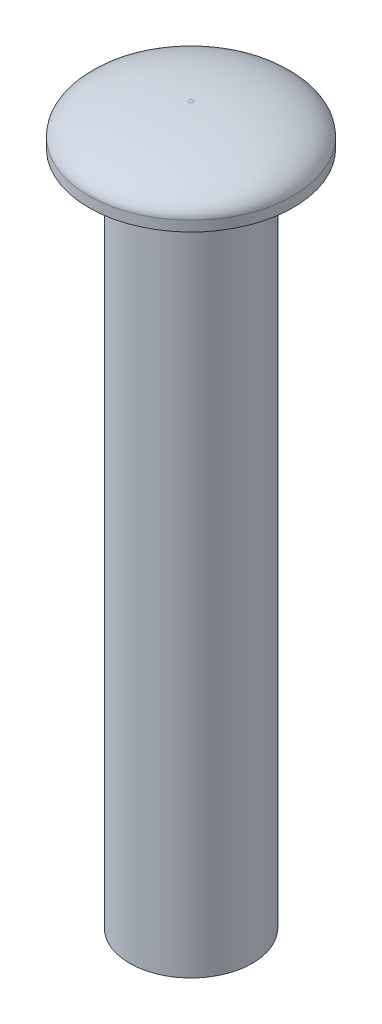
ISO-10303-21;
HEADER;
FILE_DESCRIPTION(('STEP AP214'),'2;1');
FILE_NAME('part.step','',(''),(''),'','','');
FILE_SCHEMA(('AUTOMOTIVE_DESIGN { 1 0 10303 214 1 1 1 1 }'));
ENDSEC;
DATA;
#1=APPLICATION_CONTEXT('core data for automotive mechanical design processes');
#2=APPLICATION_PROTOCOL_DEFINITION('international standard','automotive_design',2000,#1);
#3=PRODUCT_CONTEXT('',#1,'mechanical');
#4=PRODUCT('Part','Part','',(#3));
#5=PRODUCT_RELATED_PRODUCT_CATEGORY('part','',(#4));
#6=PRODUCT_DEFINITION_FORMATION('','',#4);
#7=PRODUCT_DEFINITION_CONTEXT('part definition',#1,'design');
#8=PRODUCT_DEFINITION('design','',#6,#7);
#9=PRODUCT_DEFINITION_SHAPE('','',#8);
#10=(LENGTH_UNIT() NAMED_UNIT(*) SI_UNIT(.MILLI.,.METRE.));
#11=(NAMED_UNIT(*) PLANE_ANGLE_UNIT() SI_UNIT($,.RADIAN.));
#12=(NAMED_UNIT(*) SI_UNIT($,.STERADIAN.) SOLID_ANGLE_UNIT());
#13=UNCERTAINTY_MEASURE_WITH_UNIT(LENGTH_MEASURE(1.E-05),#10,'distance_accuracy_value','');
#14=(GEOMETRIC_REPRESENTATION_CONTEXT(3) GLOBAL_UNCERTAINTY_ASSIGNED_CONTEXT((#13)) GLOBAL_UNIT_ASSIGNED_CONTEXT((#10,
#11,#12)) REPRESENTATION_CONTEXT('',''));
#15=CARTESIAN_POINT('',(0.,0.,0.));
#16=DIRECTION('',(0.,0.,1.));
#17=DIRECTION('',(1.,0.,0.));
#18=AXIS2_PLACEMENT_3D('',#15,#16,#17);
#19=CARTESIAN_POINT('',(0.,-27.,0.));
#20=DIRECTION('',(0.,1.,0.));
#21=DIRECTION('',(0.,0.,1.));
#22=AXIS2_PLACEMENT_3D('',#19,#20,#21);
#23=PLANE('',#22);
#24=CARTESIAN_POINT('',(0.,-27.,0.));
#25=DIRECTION('',(0.,1.,0.));
#26=DIRECTION('',(0.,0.,1.));
#27=AXIS2_PLACEMENT_3D('',#24,#25,#26);
#28=CIRCLE('',#27,2.4);
#29=CARTESIAN_POINT('',(0.,-27.,2.4));
#30=VERTEX_POINT('',#29);
#31=EDGE_CURVE('E66',#30,#30,#28,.T.);
#32=ORIENTED_EDGE('',*,*,#31,.F.);
#33=EDGE_LOOP('',(#32));
#34=FACE_BOUND('',#33,.T.);
#35=ADVANCED_FACE('F48',(#34),#23,.F.);
#36=CARTESIAN_POINT('',(0.,1.,0.));
#37=DIRECTION('',(0.,1.,0.));
#38=DIRECTION('',(0.,0.,1.));
#39=AXIS2_PLACEMENT_3D('',#36,#37,#38);
#40=CYLINDRICAL_SURFACE('',#39,2.4);
#41=CARTESIAN_POINT('',(0.,-34.,0.));
#42=DIRECTION('',(0.,1.,0.));
#43=DIRECTION('',(0.,0.,1.));
#44=AXIS2_PLACEMENT_3D('',#41,#42,#43);
#45=CIRCLE('',#44,2.4);
#46=CARTESIAN_POINT('',(0.,-34.,2.4));
#47=VERTEX_POINT('',#46);
#48=EDGE_CURVE('E71',#47,#47,#45,.T.);
#49=ORIENTED_EDGE('',*,*,#48,.F.);
#50=EDGE_LOOP('',(#49));
#51=FACE_BOUND('',#50,.T.);
#52=ORIENTED_EDGE('',*,*,#31,.T.);
#53=EDGE_LOOP('',(#52));
#54=FACE_BOUND('',#53,.T.);
#55=ADVANCED_FACE('F121',(#51,#54),#40,.F.);
#56=CARTESIAN_POINT('',(0.,-34.,0.));
#57=DIRECTION('',(0.,1.,0.));
#58=DIRECTION('',(0.,0.,1.));
#59=AXIS2_PLACEMENT_3D('',#56,#57,#58);
#60=PLANE('',#59);
#61=CARTESIAN_POINT('',(0.,-34.,0.));
#62=DIRECTION('',(0.,1.,0.));
#63=DIRECTION('',(0.,0.,1.));
#64=AXIS2_PLACEMENT_3D('',#61,#62,#63);
#65=CIRCLE('',#64,3.);
#66=CARTESIAN_POINT('',(0.,-34.,2.99999999999999));
#67=VERTEX_POINT('',#66);
#68=EDGE_CURVE('E76',#67,#67,#65,.T.);
#69=ORIENTED_EDGE('',*,*,#68,.F.);
#70=EDGE_LOOP('',(#69));
#71=FACE_BOUND('',#70,.T.);
#72=ORIENTED_EDGE('',*,*,#48,.T.);
#73=EDGE_LOOP('',(#72));
#74=FACE_BOUND('',#73,.T.);
#75=ADVANCED_FACE('F126',(#71,#74),#60,.F.);
#76=CARTESIAN_POINT('',(0.,1.,0.));
#77=DIRECTION('',(0.,1.,0.));
#78=DIRECTION('',(0.,0.,1.));
#79=AXIS2_PLACEMENT_3D('',#76,#77,#78);
#80=CYLINDRICAL_SURFACE('',#79,3.);
#81=CARTESIAN_POINT('',(0.,-1.,0.));
#82=DIRECTION('',(0.,1.,0.));
#83=DIRECTION('',(0.,0.,1.));
#84=AXIS2_PLACEMENT_3D('',#81,#82,#83);
#85=CIRCLE('',#84,3.);
#86=CARTESIAN_POINT('',(0.,-1.,3.));
#87=VERTEX_POINT('',#86);
#88=EDGE_CURVE('E142',#87,#87,#85,.T.);
#89=ORIENTED_EDGE('',*,*,#88,.F.);
#90=EDGE_LOOP('',(#89));
#91=FACE_BOUND('',#90,.T.);
#92=ORIENTED_EDGE('',*,*,#68,.T.);
#93=EDGE_LOOP('',(#92));
#94=FACE_BOUND('',#93,.T.);
#95=ADVANCED_FACE('F131',(#91,#94),#80,.T.);
#96=CARTESIAN_POINT('',(0.,-0.999999999999999,0.));
#97=DIRECTION('',(0.,1.,0.));
#98=DIRECTION('',(0.,0.,1.));
#99=AXIS2_PLACEMENT_3D('',#96,#97,#98);
#100=PLANE('',#99);
#101=CARTESIAN_POINT('',(0.,-1.,0.));
#102=DIRECTION('',(0.,1.,0.));
#103=DIRECTION('',(0.,0.,1.));
#104=AXIS2_PLACEMENT_3D('',#101,#102,#103);
#105=CIRCLE('',#104,5.);
#106=CARTESIAN_POINT('',(0.,-1.,5.));
#107=VERTEX_POINT('',#106);
#108=EDGE_CURVE('E145',#107,#107,#105,.T.);
#109=ORIENTED_EDGE('',*,*,#108,.F.);
#110=EDGE_LOOP('',(#109));
#111=FACE_BOUND('',#110,.T.);
#112=ORIENTED_EDGE('',*,*,#88,.T.);
#113=EDGE_LOOP('',(#112));
#114=FACE_BOUND('',#113,.T.);
#115=ADVANCED_FACE('F97',(#111,#114),#100,.F.);
#116=CARTESIAN_POINT('',(0.,1.,0.));
#117=DIRECTION('',(0.,1.,0.));
#118=DIRECTION('',(0.,0.,1.));
#119=AXIS2_PLACEMENT_3D('',#116,#117,#118);
#120=CYLINDRICAL_SURFACE('',#119,5.);
#121=CARTESIAN_POINT('',(0.,-0.499999999999999,5.));
#122=CARTESIAN_POINT('',(0.654487561244589,-0.499999999999999,5.));
#123=CARTESIAN_POINT('',(1.30874949970835,-0.499999999999999,4.86985920893377));
#124=CARTESIAN_POINT('',(2.51808482394255,-0.499999999999999,4.3689361161791));
#125=CARTESIAN_POINT('',(3.07274131317444,-0.499999999999999,3.99832649869103));
#126=CARTESIAN_POINT('',(3.99832649869103,-0.499999999999999,3.07274131317444));
#127=CARTESIAN_POINT('',(4.3689361161791,-0.499999999999999,2.51808482394254));
#128=CARTESIAN_POINT('',(4.86985920893377,-0.499999999999999,1.30874949970835));
#129=CARTESIAN_POINT('',(5.,-0.499999999999999,0.654487561244589));
#130=CARTESIAN_POINT('',(5.,-0.499999999999999,-0.654487561244592));
#131=CARTESIAN_POINT('',(4.86985920893377,-0.499999999999999,-1.30874949970835));
#132=CARTESIAN_POINT('',(4.3689361161791,-0.499999999999999,-2.51808482394256));
#133=CARTESIAN_POINT('',(3.99832649869103,-0.499999999999999,-3.07274131317445));
#134=CARTESIAN_POINT('',(3.07274131317444,-0.499999999999999,-3.99832649869103));
#135=CARTESIAN_POINT('',(2.51808482394256,-0.499999999999999,-4.3689361161791));
#136=CARTESIAN_POINT('',(1.30874949970835,-0.499999999999999,-4.86985920893377));
#137=CARTESIAN_POINT('',(0.654487561244591,-0.499999999999999,-5.));
#138=CARTESIAN_POINT('',(-0.654487561244589,-0.499999999999999,-5.));
#139=CARTESIAN_POINT('',(-1.30874949970834,-0.499999999999999,-4.86985920893378));
#140=CARTESIAN_POINT('',(-2.51808482394255,-0.499999999999999,-4.36893611617911));
#141=CARTESIAN_POINT('',(-3.07274131317445,-0.499999999999999,-3.99832649869103));
#142=CARTESIAN_POINT('',(-3.99832649869103,-0.499999999999999,-3.07274131317444));
#143=CARTESIAN_POINT('',(-4.3689361161791,-0.499999999999999,-2.51808482394256));
#144=CARTESIAN_POINT('',(-4.86985920893377,-0.499999999999999,-1.30874949970835));
#145=CARTESIAN_POINT('',(-5.,-0.499999999999999,-0.654487561244585));
#146=CARTESIAN_POINT('',(-5.,-0.499999999999999,0.654487561244597));
#147=CARTESIAN_POINT('',(-4.86985920893377,-0.499999999999999,1.30874949970833));
#148=CARTESIAN_POINT('',(-4.3689361161791,-0.499999999999999,2.51808482394254));
#149=CARTESIAN_POINT('',(-3.99832649869103,-0.499999999999999,3.07274131317443));
#150=CARTESIAN_POINT('',(-3.07274131317446,-0.499999999999999,3.99832649869102));
#151=CARTESIAN_POINT('',(-2.51808482394256,-0.499999999999999,4.36893611617909));
#152=CARTESIAN_POINT('',(-1.30874949970836,-0.499999999999999,4.86985920893377));
#153=CARTESIAN_POINT('',(-0.65448756124459,-0.499999999999999,5.));
#154=CARTESIAN_POINT('',(0.,-0.499999999999999,5.));
#155=(BOUNDED_CURVE() B_SPLINE_CURVE(3,(#121,#122,#123,#124,#125,#126,#127,#128,#129,#130,#131,
#132,#133,#134,#135,#136,#137,#138,#139,#140,#141,#142,#143,#144,#145,#146,#147,#148,#149,#150,
#151,#152,#153,#154),.UNSPECIFIED.,.T.,.F.) B_SPLINE_CURVE_WITH_KNOTS((4,2,2,2,2,2,2,2,2,2,2,2,
2,2,2,2,4),(0.,0.392699081698724,0.785398163397448,1.17809724509617,1.5707963267949,
1.96349540849362,2.35619449019234,2.74889357189107,3.14159265358979,3.53429173528852,
3.92699081698724,4.31968989868597,4.71238898038469,5.10508806208341,5.49778714378214,
5.89048622548086,6.28318530717959),
.UNSPECIFIED.) CURVE() GEOMETRIC_REPRESENTATION_ITEM() RATIONAL_B_SPLINE_CURVE((1.,1.,1.,1.,1.,
1.,1.,1.,1.,1.,1.,1.,1.,1.,1.,1.,1.,1.,1.,1.,1.,1.,1.,1.,1.,1.,1.,1.,1.,1.,1.,1.,1.,1.)) REPRESENTATION_ITEM(''));
#156=CARTESIAN_POINT('',(0.,-0.499999999999999,5.));
#157=VERTEX_POINT('',#156);
#158=EDGE_CURVE('E11',#157,#157,#155,.F.);
#159=ORIENTED_EDGE('',*,*,#158,.T.);
#160=EDGE_LOOP('',(#159));
#161=FACE_BOUND('',#160,.T.);
#162=ORIENTED_EDGE('',*,*,#108,.T.);
#163=EDGE_LOOP('',(#162));
#164=FACE_BOUND('',#163,.T.);
#165=ADVANCED_FACE('F93',(#161,#164),#120,.T.);
#166=CARTESIAN_POINT('',(0.,1.,0.));
#167=DIRECTION('',(0.,1.,0.));
#168=DIRECTION('',(0.,0.,1.));
#169=AXIS2_PLACEMENT_3D('',#166,#167,#168);
#170=PLANE('',#169);
#171=CARTESIAN_POINT('',(0.,1.,0.0999999999999977));
#172=CARTESIAN_POINT('',(-0.0130897512248917,1.,0.0999999999999977));
#173=CARTESIAN_POINT('',(-0.0261749899941669,1.,0.0973971841786731));
#174=CARTESIAN_POINT('',(-0.0503616964788509,1.,0.0873787223235796));
#175=CARTESIAN_POINT('',(-0.0614548262634887,1.,0.0799665299738181));
#176=CARTESIAN_POINT('',(-0.0799665299738204,1.,0.0614548262634867));
#177=CARTESIAN_POINT('',(-0.0873787223235815,1.,0.0503616964788489));
#178=CARTESIAN_POINT('',(-0.0973971841786749,1.,0.0261749899941648));
#179=CARTESIAN_POINT('',(-0.0999999999999994,1.,0.0130897512248902));
#180=CARTESIAN_POINT('',(-0.0999999999999994,1.,-0.0130897512248933));
#181=CARTESIAN_POINT('',(-0.0973971841786748,1.,-0.0261749899941686));
#182=CARTESIAN_POINT('',(-0.0873787223235813,1.,-0.0503616964788526));
#183=CARTESIAN_POINT('',(-0.0799665299738202,1.,-0.0614548262634902));
#184=CARTESIAN_POINT('',(-0.0614548262634885,1.,-0.0799665299738218));
#185=CARTESIAN_POINT('',(-0.0503616964788506,1.,-0.0873787223235832));
#186=CARTESIAN_POINT('',(-0.0261749899941666,1.,-0.0973971841786766));
#187=CARTESIAN_POINT('',(-0.0130897512248917,1.,-0.100000000000001));
#188=CARTESIAN_POINT('',(0.0130897512248917,1.,-0.100000000000001));
#189=CARTESIAN_POINT('',(0.0261749899941669,1.,-0.0973971841786765));
#190=CARTESIAN_POINT('',(0.0503616964788509,1.,-0.0873787223235831));
#191=CARTESIAN_POINT('',(0.0614548262634885,1.,-0.079966529973822));
#192=CARTESIAN_POINT('',(0.0799665299738201,1.,-0.0614548262634903));
#193=CARTESIAN_POINT('',(0.0873787223235814,1.,-0.0503616964788525));
#194=CARTESIAN_POINT('',(0.0973971841786749,1.,-0.0261749899941685));
#195=CARTESIAN_POINT('',(0.0999999999999994,1.,-0.0130897512248934));
#196=CARTESIAN_POINT('',(0.0999999999999994,1.,0.01308975122489));
#197=CARTESIAN_POINT('',(0.0973971841786748,1.,0.026174989994165));
#198=CARTESIAN_POINT('',(0.0873787223235815,1.,0.0503616964788489));
#199=CARTESIAN_POINT('',(0.0799665299738202,1.,0.0614548262634868));
#200=CARTESIAN_POINT('',(0.0614548262634884,1.,0.0799665299738184));
#201=CARTESIAN_POINT('',(0.0503616964788507,1.,0.0873787223235798));
#202=CARTESIAN_POINT('',(0.0261749899941668,1.,0.097397184178673));
#203=CARTESIAN_POINT('',(0.0130897512248917,1.,0.0999999999999977));
#204=CARTESIAN_POINT('',(0.,1.,0.0999999999999977));
#205=(BOUNDED_CURVE() B_SPLINE_CURVE(3,(#171,#172,#173,#174,#175,#176,#177,#178,#179,#180,#181,
#182,#183,#184,#185,#186,#187,#188,#189,#190,#191,#192,#193,#194,#195,#196,#197,#198,#199,#200,
#201,#202,#203,#204),.UNSPECIFIED.,.T.,.F.) B_SPLINE_CURVE_WITH_KNOTS((4,2,2,2,2,2,2,2,2,2,2,2,
2,2,2,2,4),(0.,0.392699081698725,0.785398163397448,1.17809724509617,1.5707963267949,
1.96349540849362,2.35619449019234,2.74889357189107,3.14159265358979,3.53429173528852,
3.92699081698724,4.31968989868597,4.71238898038469,5.10508806208341,5.49778714378214,
5.89048622548086,6.28318530717959),
.UNSPECIFIED.) CURVE() GEOMETRIC_REPRESENTATION_ITEM() RATIONAL_B_SPLINE_CURVE((1.,1.,1.,1.,1.,
1.,1.,1.,1.,1.,1.,1.,1.,1.,1.,1.,1.,1.,1.,1.,1.,1.,1.,1.,1.,1.,1.,1.,1.,1.,1.,1.,1.,1.)) REPRESENTATION_ITEM(''));
#206=CARTESIAN_POINT('',(0.,1.,0.0999999999999977));
#207=VERTEX_POINT('',#206);
#208=EDGE_CURVE('E61',#207,#207,#205,.F.);
#209=ORIENTED_EDGE('',*,*,#208,.T.);
#210=EDGE_LOOP('',(#209));
#211=FACE_BOUND('',#210,.T.);
#212=ADVANCED_FACE('F84',(#211),#170,.T.);
#213=CARTESIAN_POINT('',(0.,1.,0.0999999999999977));
#214=CARTESIAN_POINT('',(0.0130897512248917,1.,0.0999999999999977));
#215=CARTESIAN_POINT('',(0.0261749899941668,1.,0.097397184178673));
#216=CARTESIAN_POINT('',(0.0503616964788507,1.,0.0873787223235798));
#217=CARTESIAN_POINT('',(0.0614548262634884,1.,0.0799665299738184));
#218=CARTESIAN_POINT('',(0.0799665299738202,1.,0.0614548262634868));
#219=CARTESIAN_POINT('',(0.0873787223235815,1.,0.0503616964788489));
#220=CARTESIAN_POINT('',(0.0973971841786748,1.,0.026174989994165));
#221=CARTESIAN_POINT('',(0.0999999999999994,1.,0.01308975122489));
#222=CARTESIAN_POINT('',(0.0999999999999994,1.,-0.0130897512248934));
#223=CARTESIAN_POINT('',(0.0973971841786749,1.,-0.0261749899941685));
#224=CARTESIAN_POINT('',(0.0873787223235814,1.,-0.0503616964788525));
#225=CARTESIAN_POINT('',(0.0799665299738201,1.,-0.0614548262634903));
#226=CARTESIAN_POINT('',(0.0614548262634885,1.,-0.079966529973822));
#227=CARTESIAN_POINT('',(0.0503616964788509,1.,-0.0873787223235831));
#228=CARTESIAN_POINT('',(0.0261749899941669,1.,-0.0973971841786765));
#229=CARTESIAN_POINT('',(0.0130897512248917,1.,-0.100000000000001));
#230=CARTESIAN_POINT('',(-0.0130897512248917,1.,-0.100000000000001));
#231=CARTESIAN_POINT('',(-0.0261749899941666,1.,-0.0973971841786766));
#232=CARTESIAN_POINT('',(-0.0503616964788506,1.,-0.0873787223235832));
#233=CARTESIAN_POINT('',(-0.0614548262634885,1.,-0.0799665299738218));
#234=CARTESIAN_POINT('',(-0.0799665299738202,1.,-0.0614548262634902));
#235=CARTESIAN_POINT('',(-0.0873787223235813,1.,-0.0503616964788526));
#236=CARTESIAN_POINT('',(-0.0973971841786748,1.,-0.0261749899941686));
#237=CARTESIAN_POINT('',(-0.0999999999999994,1.,-0.0130897512248933));
#238=CARTESIAN_POINT('',(-0.0999999999999994,1.,0.0130897512248902));
#239=CARTESIAN_POINT('',(-0.0973971841786749,1.,0.0261749899941648));
#240=CARTESIAN_POINT('',(-0.0873787223235815,1.,0.0503616964788489));
#241=CARTESIAN_POINT('',(-0.0799665299738204,1.,0.0614548262634867));
#242=CARTESIAN_POINT('',(-0.0614548262634887,1.,0.0799665299738181));
#243=CARTESIAN_POINT('',(-0.0503616964788509,1.,0.0873787223235796));
#244=CARTESIAN_POINT('',(-0.0261749899941669,1.,0.0973971841786731));
#245=CARTESIAN_POINT('',(-0.0130897512248917,1.,0.0999999999999977));
#246=CARTESIAN_POINT('',(0.,1.,0.0999999999999977));
#247=CARTESIAN_POINT('',(0.,1.,5.));
#248=CARTESIAN_POINT('',(0.654487561244589,1.,5.));
#249=CARTESIAN_POINT('',(1.30874949970835,1.,4.86985920893378));
#250=CARTESIAN_POINT('',(2.51808482394254,0.999999999999996,4.36893611617908));
#251=CARTESIAN_POINT('',(3.07274131317444,1.,3.99832649869102));
#252=CARTESIAN_POINT('',(3.99832649869104,1.,3.07274131317445));
#253=CARTESIAN_POINT('',(4.3689361161791,0.999999999999999,2.51808482394255));
#254=CARTESIAN_POINT('',(4.86985920893377,1.,1.30874949970834));
#255=CARTESIAN_POINT('',(5.,1.,0.654487561244589));
#256=CARTESIAN_POINT('',(5.,1.,-0.654487561244591));
#257=CARTESIAN_POINT('',(4.86985920893378,1.,-1.30874949970835));
#258=CARTESIAN_POINT('',(4.36893611617909,1.,-2.51808482394255));
#259=CARTESIAN_POINT('',(3.99832649869103,0.999999999999999,-3.07274131317445));
#260=CARTESIAN_POINT('',(3.07274131317444,1.,-3.99832649869103));
#261=CARTESIAN_POINT('',(2.51808482394255,1.,-4.36893611617909));
#262=CARTESIAN_POINT('',(1.30874949970836,1.,-4.86985920893378));
#263=CARTESIAN_POINT('',(0.654487561244591,1.,-5.));
#264=CARTESIAN_POINT('',(-0.65448756124459,1.,-5.));
#265=CARTESIAN_POINT('',(-1.30874949970834,1.,-4.86985920893377));
#266=CARTESIAN_POINT('',(-2.51808482394255,1.,-4.36893611617911));
#267=CARTESIAN_POINT('',(-3.07274131317444,1.,-3.99832649869102));
#268=CARTESIAN_POINT('',(-3.99832649869104,0.999999999999999,-3.07274131317445));
#269=CARTESIAN_POINT('',(-4.36893611617909,1.,-2.51808482394256));
#270=CARTESIAN_POINT('',(-4.86985920893377,1.,-1.30874949970836));
#271=CARTESIAN_POINT('',(-5.00000000000001,1.,-0.654487561244585));
#272=CARTESIAN_POINT('',(-4.99999999999999,1.,0.654487561244597));
#273=CARTESIAN_POINT('',(-4.86985920893378,1.,1.30874949970833));
#274=CARTESIAN_POINT('',(-4.36893611617909,1.,2.51808482394255));
#275=CARTESIAN_POINT('',(-3.99832649869104,1.,3.07274131317445));
#276=CARTESIAN_POINT('',(-3.07274131317445,1.,3.998326498691));
#277=CARTESIAN_POINT('',(-2.51808482394256,1.,4.36893611617909));
#278=CARTESIAN_POINT('',(-1.30874949970836,0.999999999999997,4.86985920893377));
#279=CARTESIAN_POINT('',(-0.65448756124459,1.,5.));
#280=CARTESIAN_POINT('',(0.,1.,5.));
#281=CARTESIAN_POINT('',(0.,-0.499999999999999,5.));
#282=CARTESIAN_POINT('',(0.654487561244589,-0.499999999999999,5.));
#283=CARTESIAN_POINT('',(1.30874949970835,-0.499999999999999,4.86985920893377));
#284=CARTESIAN_POINT('',(2.51808482394255,-0.499999999999999,4.3689361161791));
#285=CARTESIAN_POINT('',(3.07274131317444,-0.499999999999999,3.99832649869103));
#286=CARTESIAN_POINT('',(3.99832649869103,-0.499999999999999,3.07274131317444));
#287=CARTESIAN_POINT('',(4.3689361161791,-0.499999999999999,2.51808482394254));
#288=CARTESIAN_POINT('',(4.86985920893377,-0.499999999999999,1.30874949970835));
#289=CARTESIAN_POINT('',(5.,-0.499999999999999,0.654487561244589));
#290=CARTESIAN_POINT('',(5.,-0.499999999999999,-0.654487561244592));
#291=CARTESIAN_POINT('',(4.86985920893377,-0.499999999999999,-1.30874949970835));
#292=CARTESIAN_POINT('',(4.3689361161791,-0.499999999999999,-2.51808482394256));
#293=CARTESIAN_POINT('',(3.99832649869103,-0.499999999999999,-3.07274131317445));
#294=CARTESIAN_POINT('',(3.07274131317444,-0.499999999999999,-3.99832649869103));
#295=CARTESIAN_POINT('',(2.51808482394256,-0.499999999999999,-4.3689361161791));
#296=CARTESIAN_POINT('',(1.30874949970835,-0.499999999999999,-4.86985920893377));
#297=CARTESIAN_POINT('',(0.654487561244591,-0.499999999999999,-5.));
#298=CARTESIAN_POINT('',(-0.654487561244589,-0.499999999999999,-5.));
#299=CARTESIAN_POINT('',(-1.30874949970834,-0.499999999999999,-4.86985920893378));
#300=CARTESIAN_POINT('',(-2.51808482394255,-0.499999999999999,-4.36893611617911));
#301=CARTESIAN_POINT('',(-3.07274131317445,-0.499999999999999,-3.99832649869103));
#302=CARTESIAN_POINT('',(-3.99832649869103,-0.499999999999999,-3.07274131317444));
#303=CARTESIAN_POINT('',(-4.3689361161791,-0.499999999999999,-2.51808482394256));
#304=CARTESIAN_POINT('',(-4.86985920893377,-0.499999999999999,-1.30874949970835));
#305=CARTESIAN_POINT('',(-5.,-0.499999999999999,-0.654487561244585));
#306=CARTESIAN_POINT('',(-5.,-0.499999999999999,0.654487561244597));
#307=CARTESIAN_POINT('',(-4.86985920893377,-0.499999999999999,1.30874949970833));
#308=CARTESIAN_POINT('',(-4.3689361161791,-0.499999999999999,2.51808482394254));
#309=CARTESIAN_POINT('',(-3.99832649869103,-0.499999999999999,3.07274131317443));
#310=CARTESIAN_POINT('',(-3.07274131317446,-0.499999999999999,3.99832649869102));
#311=CARTESIAN_POINT('',(-2.51808482394256,-0.499999999999999,4.36893611617909));
#312=CARTESIAN_POINT('',(-1.30874949970836,-0.499999999999999,4.86985920893377));
#313=CARTESIAN_POINT('',(-0.65448756124459,-0.499999999999999,5.));
#314=CARTESIAN_POINT('',(0.,-0.499999999999999,5.));
#315=(BOUNDED_SURFACE() B_SPLINE_SURFACE(2,3,((#213,#214,#215,#216,#217,#218,#219,#220,#221,
#222,#223,#224,#225,#226,#227,#228,#229,#230,#231,#232,#233,#234,#235,#236,#237,#238,#239,#240,
#241,#242,#243,#244,#245,#246),(#247,#248,#249,#250,#251,#252,#253,#254,#255,#256,#257,#258,
#259,#260,#261,#262,#263,#264,#265,#266,#267,#268,#269,#270,#271,#272,#273,#274,#275,#276,#277,
#278,#279,#280),(#281,#282,#283,#284,#285,#286,#287,#288,#289,#290,#291,#292,#293,#294,#295,
#296,#297,#298,#299,#300,#301,#302,#303,#304,#305,#306,#307,#308,#309,#310,#311,#312,#313,
#314)),.UNSPECIFIED.,.F.,.T.,.F.) B_SPLINE_SURFACE_WITH_KNOTS((3,3),(4,2,2,2,2,2,2,2,2,2,2,2,2,
2,2,2,4),(0.,1.),(0.,0.392699081698724,0.785398163397448,1.17809724509617,1.5707963267949,
1.96349540849362,2.35619449019234,2.74889357189107,3.14159265358979,3.53429173528852,
3.92699081698724,4.31968989868597,4.71238898038469,5.10508806208341,5.49778714378214,
5.89048622548086,6.28318530717959),
.UNSPECIFIED.) GEOMETRIC_REPRESENTATION_ITEM() RATIONAL_B_SPLINE_SURFACE(((1.,1.,1.,1.,1.,1.,1.,
1.,1.,1.,1.,1.,1.,1.,1.,1.,1.,1.,1.,1.,1.,1.,1.,1.,1.,1.,1.,1.,1.,1.,1.,1.,1.,1.),
(0.707106781186548,0.707106781186548,0.707106781186548,0.707106781186548,0.707106781186548,
0.707106781186548,0.707106781186548,0.707106781186548,0.707106781186548,0.707106781186548,
0.707106781186548,0.707106781186548,0.707106781186547,0.707106781186547,0.707106781186547,
0.707106781186547,0.707106781186547,0.707106781186547,0.707106781186547,0.707106781186547,
0.707106781186547,0.707106781186547,0.707106781186548,0.707106781186548,0.707106781186548,
0.707106781186548,0.707106781186548,0.707106781186548,0.707106781186548,0.707106781186548,
0.707106781186548,0.707106781186548,0.707106781186548,0.707106781186548),(1.,1.,1.,1.,1.,1.,1.,
1.,1.,1.,1.,1.,1.,1.,1.,1.,1.,1.,1.,1.,1.,1.,1.,1.,1.,1.,1.,1.,1.,1.,1.,1.,1.,1.))) REPRESENTATION_ITEM('') SURFACE());
#316=ORIENTED_EDGE('',*,*,#158,.F.);
#317=EDGE_LOOP('',(#316));
#318=FACE_BOUND('',#317,.T.);
#319=ORIENTED_EDGE('',*,*,#208,.F.);
#320=EDGE_LOOP('',(#319));
#321=FACE_BOUND('',#320,.T.);
#322=ADVANCED_FACE('F51',(#318,#321),#315,.T.);
#323=CLOSED_SHELL('',(#35,#55,#75,#95,#115,#165,#212,#322));
#324=MANIFOLD_SOLID_BREP('B2',#323);
#325=ADVANCED_BREP_SHAPE_REPRESENTATION('',(#18,#324),#14);
#326=SHAPE_DEFINITION_REPRESENTATION(#9,#325);
ENDSEC;
END-ISO-10303-21;
